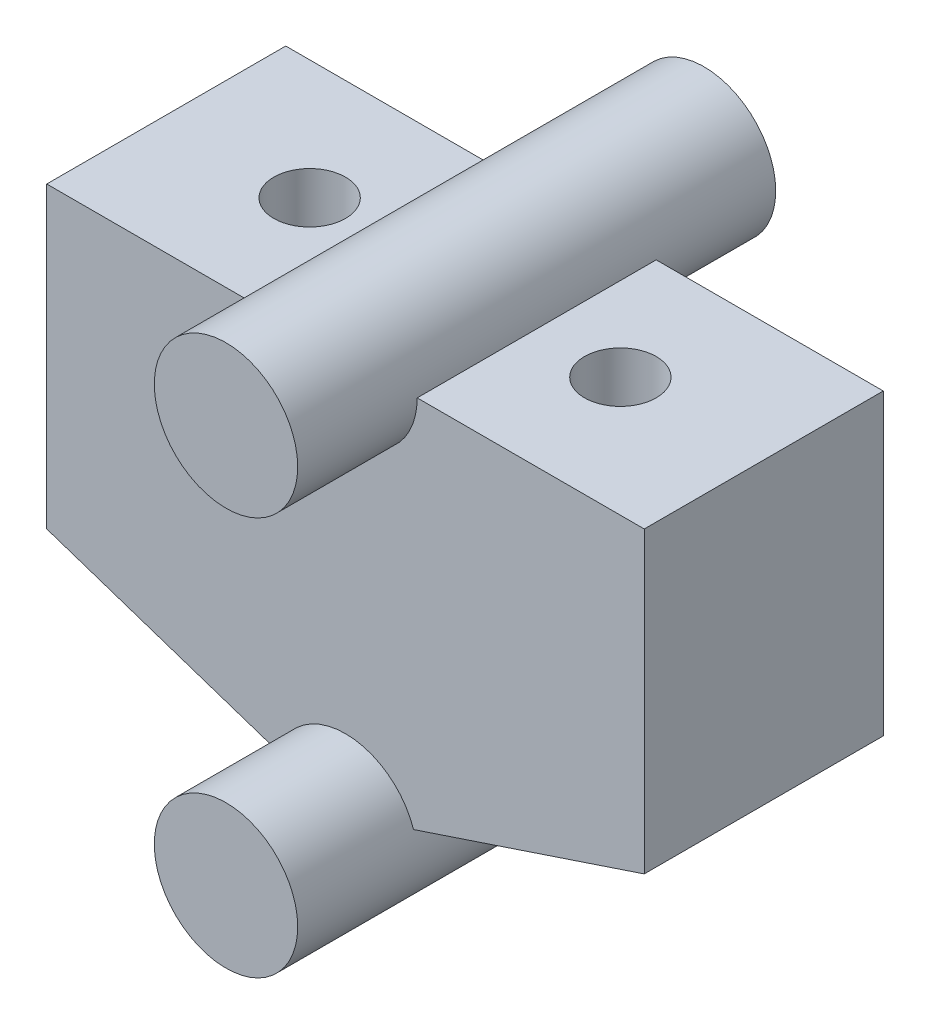
ISO-10303-21;
HEADER;
FILE_DESCRIPTION(('STEP AP214'),'2;1');
FILE_NAME('part.step','',(''),(''),'','','');
FILE_SCHEMA(('AUTOMOTIVE_DESIGN { 1 0 10303 214 1 1 1 1 }'));
ENDSEC;
DATA;
#1=APPLICATION_CONTEXT('core data for automotive mechanical design processes');
#2=APPLICATION_PROTOCOL_DEFINITION('international standard','automotive_design',2000,#1);
#3=PRODUCT_CONTEXT('',#1,'mechanical');
#4=PRODUCT('Part','Part','',(#3));
#5=PRODUCT_RELATED_PRODUCT_CATEGORY('part','',(#4));
#6=PRODUCT_DEFINITION_FORMATION('','',#4);
#7=PRODUCT_DEFINITION_CONTEXT('part definition',#1,'design');
#8=PRODUCT_DEFINITION('design','',#6,#7);
#9=PRODUCT_DEFINITION_SHAPE('','',#8);
#10=(LENGTH_UNIT() NAMED_UNIT(*) SI_UNIT(.MILLI.,.METRE.));
#11=(NAMED_UNIT(*) PLANE_ANGLE_UNIT() SI_UNIT($,.RADIAN.));
#12=(NAMED_UNIT(*) SI_UNIT($,.STERADIAN.) SOLID_ANGLE_UNIT());
#13=UNCERTAINTY_MEASURE_WITH_UNIT(LENGTH_MEASURE(1.E-05),#10,'distance_accuracy_value','');
#14=(GEOMETRIC_REPRESENTATION_CONTEXT(3) GLOBAL_UNCERTAINTY_ASSIGNED_CONTEXT((#13)) GLOBAL_UNIT_ASSIGNED_CONTEXT((#10,
#11,#12)) REPRESENTATION_CONTEXT('',''));
#15=CARTESIAN_POINT('',(0.,0.,0.));
#16=DIRECTION('',(0.,0.,1.));
#17=DIRECTION('',(1.,0.,0.));
#18=AXIS2_PLACEMENT_3D('',#15,#16,#17);
#19=CARTESIAN_POINT('',(0.,6.25,10.));
#20=DIRECTION('',(0.,1.,0.));
#21=DIRECTION('',(0.,0.,1.));
#22=AXIS2_PLACEMENT_3D('',#19,#20,#21);
#23=PLANE('',#22);
#24=DIRECTION('',(0.,0.,1.));
#25=VECTOR('',#24,1.);
#26=CARTESIAN_POINT('',(-3.,6.25,-5.));
#27=LINE('',#26,#25);
#28=CARTESIAN_POINT('',(-3.,6.25,0.));
#29=VERTEX_POINT('',#28);
#30=CARTESIAN_POINT('',(-3.,6.25,10.));
#31=VERTEX_POINT('',#30);
#32=EDGE_CURVE('E111',#29,#31,#27,.T.);
#33=ORIENTED_EDGE('',*,*,#32,.F.);
#34=DIRECTION('',(1.,0.,0.));
#35=VECTOR('',#34,1.);
#36=CARTESIAN_POINT('',(0.,6.25,0.));
#37=LINE('',#36,#35);
#38=CARTESIAN_POINT('',(-12.5,6.25,0.));
#39=VERTEX_POINT('',#38);
#40=EDGE_CURVE('E120',#39,#29,#37,.T.);
#41=ORIENTED_EDGE('',*,*,#40,.F.);
#42=DIRECTION('',(0.,0.,-1.));
#43=VECTOR('',#42,1.);
#44=CARTESIAN_POINT('',(-12.5,6.25,10.));
#45=LINE('',#44,#43);
#46=CARTESIAN_POINT('',(-12.5,6.25,10.));
#47=VERTEX_POINT('',#46);
#48=EDGE_CURVE('E143',#47,#39,#45,.T.);
#49=ORIENTED_EDGE('',*,*,#48,.F.);
#50=DIRECTION('',(1.,0.,0.));
#51=VECTOR('',#50,1.);
#52=CARTESIAN_POINT('',(0.,6.25,10.));
#53=LINE('',#52,#51);
#54=EDGE_CURVE('E121',#47,#31,#53,.T.);
#55=ORIENTED_EDGE('',*,*,#54,.T.);
#56=EDGE_LOOP('',(#33,#41,#49,#55));
#57=FACE_BOUND('',#56,.T.);
#58=CARTESIAN_POINT('',(-6.5,6.25,5.));
#59=DIRECTION('',(0.,1.,0.));
#60=DIRECTION('',(0.,0.,1.));
#61=AXIS2_PLACEMENT_3D('',#58,#59,#60);
#62=CIRCLE('',#61,1.5);
#63=CARTESIAN_POINT('',(-6.5,6.25,6.5));
#64=VERTEX_POINT('',#63);
#65=EDGE_CURVE('E154',#64,#64,#62,.T.);
#66=ORIENTED_EDGE('',*,*,#65,.F.);
#67=EDGE_LOOP('',(#66));
#68=FACE_BOUND('',#67,.T.);
#69=ADVANCED_FACE('F36',(#57,#68),#23,.T.);
#70=CARTESIAN_POINT('',(3.125,-9.375,10.));
#71=DIRECTION('',(-0.316227766016838,0.948683298050514,0.));
#72=DIRECTION('',(-0.948683298050514,-0.316227766016838,0.));
#73=AXIS2_PLACEMENT_3D('',#70,#71,#72);
#74=PLANE('',#73);
#75=CARTESIAN_POINT('',(6.5,-8.25,5.));
#76=DIRECTION('',(-0.316227766016838,0.948683298050514,0.));
#77=DIRECTION('',(0.948683298050514,0.316227766016838,0.));
#78=AXIS2_PLACEMENT_3D('',#75,#76,#77);
#79=ELLIPSE('',#78,1.58113883008419,1.5);
#80=CARTESIAN_POINT('',(8.,-7.75,5.));
#81=VERTEX_POINT('',#80);
#82=EDGE_CURVE('E153',#81,#81,#79,.T.);
#83=ORIENTED_EDGE('',*,*,#82,.T.);
#84=EDGE_LOOP('',(#83));
#85=FACE_BOUND('',#84,.T.);
#86=DIRECTION('',(0.948683298050514,0.316227766016838,0.));
#87=VECTOR('',#86,1.);
#88=CARTESIAN_POINT('',(3.125,-9.375,0.));
#89=LINE('',#88,#87);
#90=CARTESIAN_POINT('',(2.84604989415154,-9.46798336861616,0.));
#91=VERTEX_POINT('',#90);
#92=CARTESIAN_POINT('',(12.5,-6.25,0.));
#93=VERTEX_POINT('',#92);
#94=EDGE_CURVE('E185',#91,#93,#89,.T.);
#95=ORIENTED_EDGE('',*,*,#94,.T.);
#96=DIRECTION('',(0.,0.,-1.));
#97=VECTOR('',#96,1.);
#98=CARTESIAN_POINT('',(12.5,-6.25,10.));
#99=LINE('',#98,#97);
#100=CARTESIAN_POINT('',(12.5,-6.25,10.));
#101=VERTEX_POINT('',#100);
#102=EDGE_CURVE('E148',#101,#93,#99,.T.);
#103=ORIENTED_EDGE('',*,*,#102,.F.);
#104=DIRECTION('',(0.948683298050514,0.316227766016838,0.));
#105=VECTOR('',#104,1.);
#106=CARTESIAN_POINT('',(3.125,-9.375,10.));
#107=LINE('',#106,#105);
#108=CARTESIAN_POINT('',(2.84604989415154,-9.46798336861616,10.));
#109=VERTEX_POINT('',#108);
#110=EDGE_CURVE('E92',#109,#101,#107,.T.);
#111=ORIENTED_EDGE('',*,*,#110,.F.);
#112=DIRECTION('',(0.,0.,-1.));
#113=VECTOR('',#112,1.);
#114=CARTESIAN_POINT('',(2.84604989415154,-9.46798336861616,10.));
#115=LINE('',#114,#113);
#116=EDGE_CURVE('E44',#109,#91,#115,.T.);
#117=ORIENTED_EDGE('',*,*,#116,.T.);
#118=EDGE_LOOP('',(#95,#103,#111,#117));
#119=FACE_BOUND('',#118,.T.);
#120=ADVANCED_FACE('F38',(#85,#119),#74,.F.);
#121=CARTESIAN_POINT('',(12.5,0.,10.));
#122=DIRECTION('',(1.,0.,0.));
#123=DIRECTION('',(0.,0.,-1.));
#124=AXIS2_PLACEMENT_3D('',#121,#122,#123);
#125=PLANE('',#124);
#126=DIRECTION('',(0.,-1.,0.));
#127=VECTOR('',#126,1.);
#128=CARTESIAN_POINT('',(12.5,0.,0.));
#129=LINE('',#128,#127);
#130=CARTESIAN_POINT('',(12.5,6.25,0.));
#131=VERTEX_POINT('',#130);
#132=EDGE_CURVE('E132',#131,#93,#129,.T.);
#133=ORIENTED_EDGE('',*,*,#132,.F.);
#134=DIRECTION('',(0.,0.,-1.));
#135=VECTOR('',#134,1.);
#136=CARTESIAN_POINT('',(12.5,6.25,10.));
#137=LINE('',#136,#135);
#138=CARTESIAN_POINT('',(12.5,6.25,10.));
#139=VERTEX_POINT('',#138);
#140=EDGE_CURVE('E145',#139,#131,#137,.T.);
#141=ORIENTED_EDGE('',*,*,#140,.F.);
#142=DIRECTION('',(0.,-1.,0.));
#143=VECTOR('',#142,1.);
#144=CARTESIAN_POINT('',(12.5,0.,10.));
#145=LINE('',#144,#143);
#146=EDGE_CURVE('E177',#139,#101,#145,.T.);
#147=ORIENTED_EDGE('',*,*,#146,.T.);
#148=ORIENTED_EDGE('',*,*,#102,.T.);
#149=EDGE_LOOP('',(#133,#141,#147,#148));
#150=FACE_BOUND('',#149,.T.);
#151=ADVANCED_FACE('F193',(#150),#125,.T.);
#152=DIRECTION('',(0.,0.,1.));
#153=VECTOR('',#152,1.);
#154=CARTESIAN_POINT('',(3.,6.25,-5.));
#155=LINE('',#154,#153);
#156=CARTESIAN_POINT('',(3.,6.25,10.));
#157=VERTEX_POINT('',#156);
#158=CARTESIAN_POINT('',(3.,6.25,0.));
#159=VERTEX_POINT('',#158);
#160=EDGE_CURVE('E51',#157,#159,#155,.F.);
#161=ORIENTED_EDGE('',*,*,#160,.F.);
#162=EDGE_CURVE('E180',#157,#139,#53,.T.);
#163=ORIENTED_EDGE('',*,*,#162,.T.);
#164=ORIENTED_EDGE('',*,*,#140,.T.);
#165=EDGE_CURVE('E128',#159,#131,#37,.T.);
#166=ORIENTED_EDGE('',*,*,#165,.F.);
#167=EDGE_LOOP('',(#161,#163,#164,#166));
#168=FACE_BOUND('',#167,.T.);
#169=CARTESIAN_POINT('',(6.5,6.25,5.));
#170=DIRECTION('',(0.,1.,0.));
#171=DIRECTION('',(0.,0.,-1.));
#172=AXIS2_PLACEMENT_3D('',#169,#170,#171);
#173=CIRCLE('',#172,1.5);
#174=CARTESIAN_POINT('',(6.5,6.25,3.5));
#175=VERTEX_POINT('',#174);
#176=EDGE_CURVE('E161',#175,#175,#173,.T.);
#177=ORIENTED_EDGE('',*,*,#176,.F.);
#178=EDGE_LOOP('',(#177));
#179=FACE_BOUND('',#178,.T.);
#180=ADVANCED_FACE('F204',(#168,#179),#23,.T.);
#181=CARTESIAN_POINT('',(-12.5,0.,10.));
#182=DIRECTION('',(1.,0.,0.));
#183=DIRECTION('',(0.,0.,-1.));
#184=AXIS2_PLACEMENT_3D('',#181,#182,#183);
#185=PLANE('',#184);
#186=DIRECTION('',(0.,-1.,0.));
#187=VECTOR('',#186,1.);
#188=CARTESIAN_POINT('',(-12.5,0.,0.));
#189=LINE('',#188,#187);
#190=CARTESIAN_POINT('',(-12.5,-6.25,0.));
#191=VERTEX_POINT('',#190);
#192=EDGE_CURVE('E127',#39,#191,#189,.T.);
#193=ORIENTED_EDGE('',*,*,#192,.T.);
#194=DIRECTION('',(0.,0.,-1.));
#195=VECTOR('',#194,1.);
#196=CARTESIAN_POINT('',(-12.5,-6.25,10.));
#197=LINE('',#196,#195);
#198=CARTESIAN_POINT('',(-12.5,-6.25,10.));
#199=VERTEX_POINT('',#198);
#200=EDGE_CURVE('E139',#199,#191,#197,.T.);
#201=ORIENTED_EDGE('',*,*,#200,.F.);
#202=DIRECTION('',(0.,-1.,0.));
#203=VECTOR('',#202,1.);
#204=CARTESIAN_POINT('',(-12.5,0.,10.));
#205=LINE('',#204,#203);
#206=EDGE_CURVE('E59',#47,#199,#205,.T.);
#207=ORIENTED_EDGE('',*,*,#206,.F.);
#208=ORIENTED_EDGE('',*,*,#48,.T.);
#209=EDGE_LOOP('',(#193,#201,#207,#208));
#210=FACE_BOUND('',#209,.T.);
#211=ADVANCED_FACE('F201',(#210),#185,.F.);
#212=CARTESIAN_POINT('',(-3.125,-9.375,10.));
#213=DIRECTION('',(0.316227766016838,0.948683298050514,0.));
#214=DIRECTION('',(-0.948683298050514,0.316227766016838,0.));
#215=AXIS2_PLACEMENT_3D('',#212,#213,#214);
#216=PLANE('',#215);
#217=CARTESIAN_POINT('',(-6.5,-8.25,5.));
#218=DIRECTION('',(0.316227766016838,0.948683298050514,0.));
#219=DIRECTION('',(-0.948683298050514,0.316227766016838,0.));
#220=AXIS2_PLACEMENT_3D('',#217,#218,#219);
#221=ELLIPSE('',#220,1.58113883008419,1.5);
#222=CARTESIAN_POINT('',(-8.,-7.75,5.));
#223=VERTEX_POINT('',#222);
#224=EDGE_CURVE('E151',#223,#223,#221,.T.);
#225=ORIENTED_EDGE('',*,*,#224,.T.);
#226=EDGE_LOOP('',(#225));
#227=FACE_BOUND('',#226,.T.);
#228=DIRECTION('',(0.948683298050514,-0.316227766016838,0.));
#229=VECTOR('',#228,1.);
#230=CARTESIAN_POINT('',(-3.125,-9.375,0.));
#231=LINE('',#230,#229);
#232=CARTESIAN_POINT('',(-2.84604989415154,-9.46798336861616,0.));
#233=VERTEX_POINT('',#232);
#234=EDGE_CURVE('E130',#191,#233,#231,.T.);
#235=ORIENTED_EDGE('',*,*,#234,.T.);
#236=DIRECTION('',(0.,0.,-1.));
#237=VECTOR('',#236,1.);
#238=CARTESIAN_POINT('',(-2.84604989415154,-9.46798336861616,10.));
#239=LINE('',#238,#237);
#240=CARTESIAN_POINT('',(-2.84604989415154,-9.46798336861616,10.));
#241=VERTEX_POINT('',#240);
#242=EDGE_CURVE('E85',#241,#233,#239,.T.);
#243=ORIENTED_EDGE('',*,*,#242,.F.);
#244=DIRECTION('',(0.948683298050514,-0.316227766016838,0.));
#245=VECTOR('',#244,1.);
#246=CARTESIAN_POINT('',(-3.125,-9.375,10.));
#247=LINE('',#246,#245);
#248=EDGE_CURVE('E140',#199,#241,#247,.T.);
#249=ORIENTED_EDGE('',*,*,#248,.F.);
#250=ORIENTED_EDGE('',*,*,#200,.T.);
#251=EDGE_LOOP('',(#235,#243,#249,#250));
#252=FACE_BOUND('',#251,.T.);
#253=ADVANCED_FACE('F199',(#227,#252),#216,.F.);
#254=CARTESIAN_POINT('',(0.,0.,10.));
#255=DIRECTION('',(0.,0.,1.));
#256=DIRECTION('',(1.,0.,0.));
#257=AXIS2_PLACEMENT_3D('',#254,#255,#256);
#258=PLANE('',#257);
#259=CARTESIAN_POINT('',(0.,6.25,10.));
#260=DIRECTION('',(0.,0.,1.));
#261=DIRECTION('',(1.,0.,0.));
#262=AXIS2_PLACEMENT_3D('',#259,#260,#261);
#263=CIRCLE('',#262,3.);
#264=EDGE_CURVE('E122',#31,#157,#263,.T.);
#265=ORIENTED_EDGE('',*,*,#264,.F.);
#266=ORIENTED_EDGE('',*,*,#54,.F.);
#267=ORIENTED_EDGE('',*,*,#206,.T.);
#268=ORIENTED_EDGE('',*,*,#248,.T.);
#269=CARTESIAN_POINT('',(0.,-10.4166666666667,10.));
#270=DIRECTION('',(0.,0.,1.));
#271=DIRECTION('',(1.,0.,0.));
#272=AXIS2_PLACEMENT_3D('',#269,#270,#271);
#273=CIRCLE('',#272,3.);
#274=EDGE_CURVE('E137',#109,#241,#273,.T.);
#275=ORIENTED_EDGE('',*,*,#274,.F.);
#276=ORIENTED_EDGE('',*,*,#110,.T.);
#277=ORIENTED_EDGE('',*,*,#146,.F.);
#278=ORIENTED_EDGE('',*,*,#162,.F.);
#279=EDGE_LOOP('',(#265,#266,#267,#268,#275,#276,#277,#278));
#280=FACE_BOUND('',#279,.T.);
#281=ADVANCED_FACE('F194',(#280),#258,.T.);
#282=CARTESIAN_POINT('',(0.,0.,0.));
#283=DIRECTION('',(0.,0.,1.));
#284=DIRECTION('',(1.,0.,0.));
#285=AXIS2_PLACEMENT_3D('',#282,#283,#284);
#286=PLANE('',#285);
#287=ORIENTED_EDGE('',*,*,#40,.T.);
#288=CARTESIAN_POINT('',(0.,6.25,0.));
#289=DIRECTION('',(0.,0.,1.));
#290=DIRECTION('',(1.,0.,0.));
#291=AXIS2_PLACEMENT_3D('',#288,#289,#290);
#292=CIRCLE('',#291,3.);
#293=EDGE_CURVE('E11',#29,#159,#292,.T.);
#294=ORIENTED_EDGE('',*,*,#293,.T.);
#295=ORIENTED_EDGE('',*,*,#165,.T.);
#296=ORIENTED_EDGE('',*,*,#132,.T.);
#297=ORIENTED_EDGE('',*,*,#94,.F.);
#298=CARTESIAN_POINT('',(0.,-10.4166666666667,0.));
#299=DIRECTION('',(0.,0.,1.));
#300=DIRECTION('',(1.,0.,0.));
#301=AXIS2_PLACEMENT_3D('',#298,#299,#300);
#302=CIRCLE('',#301,3.);
#303=EDGE_CURVE('E174',#91,#233,#302,.T.);
#304=ORIENTED_EDGE('',*,*,#303,.T.);
#305=ORIENTED_EDGE('',*,*,#234,.F.);
#306=ORIENTED_EDGE('',*,*,#192,.F.);
#307=EDGE_LOOP('',(#287,#294,#295,#296,#297,#304,#305,#306));
#308=FACE_BOUND('',#307,.T.);
#309=ADVANCED_FACE('F125',(#308),#286,.F.);
#310=CARTESIAN_POINT('',(0.,-10.4166666666667,-5.));
#311=DIRECTION('',(0.,0.,1.));
#312=DIRECTION('',(1.,0.,0.));
#313=AXIS2_PLACEMENT_3D('',#310,#311,#312);
#314=CYLINDRICAL_SURFACE('',#313,3.);
#315=ORIENTED_EDGE('',*,*,#116,.F.);
#316=ORIENTED_EDGE('',*,*,#274,.T.);
#317=ORIENTED_EDGE('',*,*,#242,.T.);
#318=ORIENTED_EDGE('',*,*,#303,.F.);
#319=EDGE_LOOP('',(#315,#316,#317,#318));
#320=FACE_BOUND('',#319,.T.);
#321=CARTESIAN_POINT('',(0.,-10.4166666666667,-5.));
#322=DIRECTION('',(0.,0.,1.));
#323=DIRECTION('',(1.,0.,0.));
#324=AXIS2_PLACEMENT_3D('',#321,#322,#323);
#325=CIRCLE('',#324,3.);
#326=CARTESIAN_POINT('',(3.,-10.4166666666667,-5.));
#327=VERTEX_POINT('',#326);
#328=EDGE_CURVE('E171',#327,#327,#325,.T.);
#329=ORIENTED_EDGE('',*,*,#328,.T.);
#330=EDGE_LOOP('',(#329));
#331=FACE_BOUND('',#330,.T.);
#332=CARTESIAN_POINT('',(0.,-10.4166666666667,15.));
#333=DIRECTION('',(0.,0.,1.));
#334=DIRECTION('',(1.,0.,0.));
#335=AXIS2_PLACEMENT_3D('',#332,#333,#334);
#336=CIRCLE('',#335,3.);
#337=CARTESIAN_POINT('',(3.,-10.4166666666667,15.));
#338=VERTEX_POINT('',#337);
#339=EDGE_CURVE('E158',#338,#338,#336,.T.);
#340=ORIENTED_EDGE('',*,*,#339,.F.);
#341=EDGE_LOOP('',(#340));
#342=FACE_BOUND('',#341,.T.);
#343=ADVANCED_FACE('F196',(#320,#331,#342),#314,.T.);
#344=CARTESIAN_POINT('',(0.,0.,-5.));
#345=DIRECTION('',(0.,0.,1.));
#346=DIRECTION('',(1.,0.,0.));
#347=AXIS2_PLACEMENT_3D('',#344,#345,#346);
#348=PLANE('',#347);
#349=ORIENTED_EDGE('',*,*,#328,.F.);
#350=EDGE_LOOP('',(#349));
#351=FACE_BOUND('',#350,.T.);
#352=ADVANCED_FACE('F329',(#351),#348,.F.);
#353=CARTESIAN_POINT('',(0.,0.,15.));
#354=DIRECTION('',(0.,0.,1.));
#355=DIRECTION('',(1.,0.,0.));
#356=AXIS2_PLACEMENT_3D('',#353,#354,#355);
#357=PLANE('',#356);
#358=ORIENTED_EDGE('',*,*,#339,.T.);
#359=EDGE_LOOP('',(#358));
#360=FACE_BOUND('',#359,.T.);
#361=ADVANCED_FACE('F256',(#360),#357,.T.);
#362=CARTESIAN_POINT('',(-6.5,-13.4166666666667,5.));
#363=DIRECTION('',(0.,1.,0.));
#364=DIRECTION('',(0.,0.,1.));
#365=AXIS2_PLACEMENT_3D('',#362,#363,#364);
#366=CYLINDRICAL_SURFACE('',#365,1.5);
#367=ORIENTED_EDGE('',*,*,#65,.T.);
#368=EDGE_LOOP('',(#367));
#369=FACE_BOUND('',#368,.T.);
#370=ORIENTED_EDGE('',*,*,#224,.F.);
#371=EDGE_LOOP('',(#370));
#372=FACE_BOUND('',#371,.T.);
#373=ADVANCED_FACE('F227',(#369,#372),#366,.F.);
#374=CARTESIAN_POINT('',(6.5,-13.4166666666667,5.));
#375=DIRECTION('',(0.,1.,0.));
#376=DIRECTION('',(0.,0.,1.));
#377=AXIS2_PLACEMENT_3D('',#374,#375,#376);
#378=CYLINDRICAL_SURFACE('',#377,1.5);
#379=ORIENTED_EDGE('',*,*,#176,.T.);
#380=EDGE_LOOP('',(#379));
#381=FACE_BOUND('',#380,.T.);
#382=ORIENTED_EDGE('',*,*,#82,.F.);
#383=EDGE_LOOP('',(#382));
#384=FACE_BOUND('',#383,.T.);
#385=ADVANCED_FACE('F219',(#381,#384),#378,.F.);
#386=CARTESIAN_POINT('',(0.,6.25,-5.));
#387=DIRECTION('',(0.,0.,1.));
#388=DIRECTION('',(1.,0.,0.));
#389=AXIS2_PLACEMENT_3D('',#386,#387,#388);
#390=CYLINDRICAL_SURFACE('',#389,3.);
#391=ORIENTED_EDGE('',*,*,#32,.T.);
#392=ORIENTED_EDGE('',*,*,#264,.T.);
#393=ORIENTED_EDGE('',*,*,#160,.T.);
#394=ORIENTED_EDGE('',*,*,#293,.F.);
#395=EDGE_LOOP('',(#391,#392,#393,#394));
#396=FACE_BOUND('',#395,.T.);
#397=CARTESIAN_POINT('',(0.,6.25,-5.));
#398=DIRECTION('',(0.,0.,1.));
#399=DIRECTION('',(1.,0.,0.));
#400=AXIS2_PLACEMENT_3D('',#397,#398,#399);
#401=CIRCLE('',#400,3.);
#402=CARTESIAN_POINT('',(3.,6.25,-5.));
#403=VERTEX_POINT('',#402);
#404=EDGE_CURVE('E206',#403,#403,#401,.T.);
#405=ORIENTED_EDGE('',*,*,#404,.T.);
#406=EDGE_LOOP('',(#405));
#407=FACE_BOUND('',#406,.T.);
#408=CARTESIAN_POINT('',(0.,6.25,15.));
#409=DIRECTION('',(0.,0.,1.));
#410=DIRECTION('',(1.,0.,0.));
#411=AXIS2_PLACEMENT_3D('',#408,#409,#410);
#412=CIRCLE('',#411,3.);
#413=CARTESIAN_POINT('',(3.,6.25,15.));
#414=VERTEX_POINT('',#413);
#415=EDGE_CURVE('E209',#414,#414,#412,.T.);
#416=ORIENTED_EDGE('',*,*,#415,.F.);
#417=EDGE_LOOP('',(#416));
#418=FACE_BOUND('',#417,.T.);
#419=ADVANCED_FACE('F109',(#396,#407,#418),#390,.T.);
#420=CARTESIAN_POINT('',(0.,6.25,-5.));
#421=DIRECTION('',(0.,0.,1.));
#422=DIRECTION('',(1.,0.,0.));
#423=AXIS2_PLACEMENT_3D('',#420,#421,#422);
#424=PLANE('',#423);
#425=ORIENTED_EDGE('',*,*,#404,.F.);
#426=EDGE_LOOP('',(#425));
#427=FACE_BOUND('',#426,.T.);
#428=ADVANCED_FACE('F218',(#427),#424,.F.);
#429=CARTESIAN_POINT('',(0.,6.25,15.));
#430=DIRECTION('',(0.,0.,1.));
#431=DIRECTION('',(1.,0.,0.));
#432=AXIS2_PLACEMENT_3D('',#429,#430,#431);
#433=PLANE('',#432);
#434=ORIENTED_EDGE('',*,*,#415,.T.);
#435=EDGE_LOOP('',(#434));
#436=FACE_BOUND('',#435,.T.);
#437=ADVANCED_FACE('F215',(#436),#433,.T.);
#438=CLOSED_SHELL('',(#69,#120,#151,#180,#211,#253,#281,#309,#343,#352,#361,#373,#385,#419,#428,#437));
#439=MANIFOLD_SOLID_BREP('B2',#438);
#440=ADVANCED_BREP_SHAPE_REPRESENTATION('',(#18,#439),#14);
#441=SHAPE_DEFINITION_REPRESENTATION(#9,#440);
ENDSEC;
END-ISO-10303-21;
